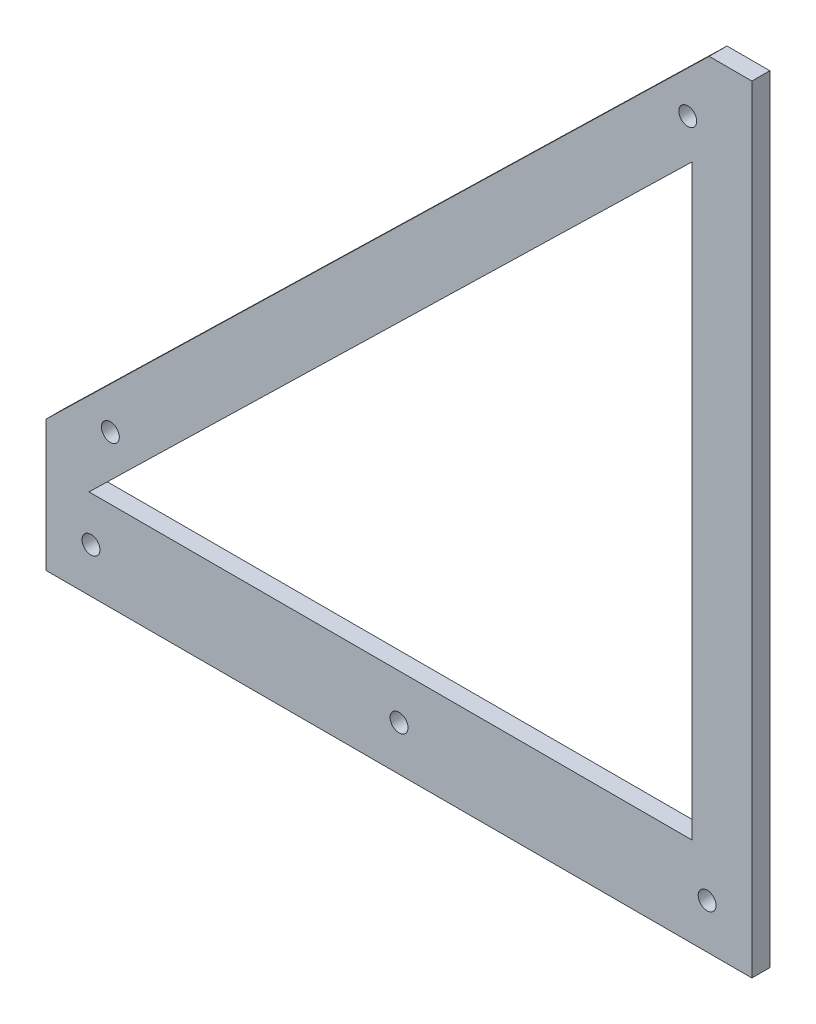
ISO-10303-21;
HEADER;
FILE_DESCRIPTION(('STEP AP214'),'2;1');
FILE_NAME('part.step','',(''),(''),'','','');
FILE_SCHEMA(('AUTOMOTIVE_DESIGN { 1 0 10303 214 1 1 1 1 }'));
ENDSEC;
DATA;
#1=APPLICATION_CONTEXT('core data for automotive mechanical design processes');
#2=APPLICATION_PROTOCOL_DEFINITION('international standard','automotive_design',2000,#1);
#3=PRODUCT_CONTEXT('',#1,'mechanical');
#4=PRODUCT('Part','Part','',(#3));
#5=PRODUCT_RELATED_PRODUCT_CATEGORY('part','',(#4));
#6=PRODUCT_DEFINITION_FORMATION('','',#4);
#7=PRODUCT_DEFINITION_CONTEXT('part definition',#1,'design');
#8=PRODUCT_DEFINITION('design','',#6,#7);
#9=PRODUCT_DEFINITION_SHAPE('','',#8);
#10=(LENGTH_UNIT() NAMED_UNIT(*) SI_UNIT(.MILLI.,.METRE.));
#11=(NAMED_UNIT(*) PLANE_ANGLE_UNIT() SI_UNIT($,.RADIAN.));
#12=(NAMED_UNIT(*) SI_UNIT($,.STERADIAN.) SOLID_ANGLE_UNIT());
#13=UNCERTAINTY_MEASURE_WITH_UNIT(LENGTH_MEASURE(1.E-05),#10,'distance_accuracy_value','');
#14=(GEOMETRIC_REPRESENTATION_CONTEXT(3) GLOBAL_UNCERTAINTY_ASSIGNED_CONTEXT((#13)) GLOBAL_UNIT_ASSIGNED_CONTEXT((#10,
#11,#12)) REPRESENTATION_CONTEXT('',''));
#15=CARTESIAN_POINT('',(0.,0.,0.));
#16=DIRECTION('',(0.,0.,1.));
#17=DIRECTION('',(1.,0.,0.));
#18=AXIS2_PLACEMENT_3D('',#15,#16,#17);
#19=CARTESIAN_POINT('',(0.,0.,3.));
#20=DIRECTION('',(0.,1.,0.));
#21=DIRECTION('',(0.,0.,1.));
#22=AXIS2_PLACEMENT_3D('',#19,#20,#21);
#23=PLANE('',#22);
#24=DIRECTION('',(1.,0.,0.));
#25=VECTOR('',#24,1.);
#26=CARTESIAN_POINT('',(0.,0.,0.));
#27=LINE('',#26,#25);
#28=CARTESIAN_POINT('',(7.16666666666672,0.,0.));
#29=VERTEX_POINT('',#28);
#30=CARTESIAN_POINT('',(108.208469633658,0.,0.));
#31=VERTEX_POINT('',#30);
#32=EDGE_CURVE('E124',#29,#31,#27,.T.);
#33=ORIENTED_EDGE('',*,*,#32,.F.);
#34=DIRECTION('',(0.,0.,-1.));
#35=VECTOR('',#34,1.);
#36=CARTESIAN_POINT('',(7.16666666666672,0.,3.));
#37=LINE('',#36,#35);
#38=CARTESIAN_POINT('',(7.16666666666672,0.,3.));
#39=VERTEX_POINT('',#38);
#40=EDGE_CURVE('E11',#39,#29,#37,.T.);
#41=ORIENTED_EDGE('',*,*,#40,.F.);
#42=DIRECTION('',(1.,0.,0.));
#43=VECTOR('',#42,1.);
#44=CARTESIAN_POINT('',(0.,0.,3.));
#45=LINE('',#44,#43);
#46=CARTESIAN_POINT('',(108.208469633658,0.,3.));
#47=VERTEX_POINT('',#46);
#48=EDGE_CURVE('E123',#39,#47,#45,.T.);
#49=ORIENTED_EDGE('',*,*,#48,.T.);
#50=DIRECTION('',(0.,0.,-1.));
#51=VECTOR('',#50,1.);
#52=CARTESIAN_POINT('',(108.208469633658,0.,3.));
#53=LINE('',#52,#51);
#54=EDGE_CURVE('E102',#47,#31,#53,.T.);
#55=ORIENTED_EDGE('',*,*,#54,.T.);
#56=EDGE_LOOP('',(#33,#41,#49,#55));
#57=FACE_BOUND('',#56,.T.);
#58=ADVANCED_FACE('F47',(#57),#23,.T.);
#59=CARTESIAN_POINT('',(3.48837209302328,-3.5820748373836,3.));
#60=DIRECTION('',(-0.697674418604651,0.716414967476715,0.));
#61=DIRECTION('',(-0.716414967476715,-0.697674418604651,0.));
#62=AXIS2_PLACEMENT_3D('',#59,#60,#61);
#63=PLANE('',#62);
#64=DIRECTION('',(0.716414967476715,0.697674418604651,0.));
#65=VECTOR('',#64,1.);
#66=CARTESIAN_POINT('',(3.48837209302328,-3.5820748373836,0.));
#67=LINE('',#66,#65);
#68=CARTESIAN_POINT('',(108.208469633658,98.3986716358666,0.));
#69=VERTEX_POINT('',#68);
#70=EDGE_CURVE('E187',#29,#69,#67,.T.);
#71=ORIENTED_EDGE('',*,*,#70,.T.);
#72=DIRECTION('',(0.,0.,-1.));
#73=VECTOR('',#72,1.);
#74=CARTESIAN_POINT('',(108.208469633658,98.3986716358666,3.));
#75=LINE('',#74,#73);
#76=CARTESIAN_POINT('',(108.208469633658,98.3986716358666,3.));
#77=VERTEX_POINT('',#76);
#78=EDGE_CURVE('E58',#77,#69,#75,.T.);
#79=ORIENTED_EDGE('',*,*,#78,.F.);
#80=DIRECTION('',(0.716414967476715,0.697674418604651,0.));
#81=VECTOR('',#80,1.);
#82=CARTESIAN_POINT('',(3.48837209302328,-3.5820748373836,3.));
#83=LINE('',#82,#81);
#84=EDGE_CURVE('E128',#39,#77,#83,.T.);
#85=ORIENTED_EDGE('',*,*,#84,.F.);
#86=ORIENTED_EDGE('',*,*,#40,.T.);
#87=EDGE_LOOP('',(#71,#79,#85,#86));
#88=FACE_BOUND('',#87,.T.);
#89=ADVANCED_FACE('F129',(#88),#63,.F.);
#90=CARTESIAN_POINT('',(118.208469633658,0.,3.));
#91=DIRECTION('',(1.,0.,0.));
#92=DIRECTION('',(0.,0.,-1.));
#93=AXIS2_PLACEMENT_3D('',#90,#91,#92);
#94=PLANE('',#93);
#95=DIRECTION('',(0.,-1.,0.));
#96=VECTOR('',#95,1.);
#97=CARTESIAN_POINT('',(118.208469633658,0.,0.));
#98=LINE('',#97,#96);
#99=CARTESIAN_POINT('',(118.208469633658,115.116279069767,0.));
#100=VERTEX_POINT('',#99);
#101=CARTESIAN_POINT('',(118.208469633658,-15.,0.));
#102=VERTEX_POINT('',#101);
#103=EDGE_CURVE('E165',#100,#102,#98,.T.);
#104=ORIENTED_EDGE('',*,*,#103,.F.);
#105=DIRECTION('',(0.,0.,-1.));
#106=VECTOR('',#105,1.);
#107=CARTESIAN_POINT('',(118.208469633658,115.116279069767,3.));
#108=LINE('',#107,#106);
#109=CARTESIAN_POINT('',(118.208469633658,115.116279069767,3.));
#110=VERTEX_POINT('',#109);
#111=EDGE_CURVE('E51',#110,#100,#108,.T.);
#112=ORIENTED_EDGE('',*,*,#111,.F.);
#113=DIRECTION('',(0.,-1.,0.));
#114=VECTOR('',#113,1.);
#115=CARTESIAN_POINT('',(118.208469633658,0.,3.));
#116=LINE('',#115,#114);
#117=CARTESIAN_POINT('',(118.208469633658,-15.,3.));
#118=VERTEX_POINT('',#117);
#119=EDGE_CURVE('E251',#110,#118,#116,.T.);
#120=ORIENTED_EDGE('',*,*,#119,.T.);
#121=DIRECTION('',(0.,0.,-1.));
#122=VECTOR('',#121,1.);
#123=CARTESIAN_POINT('',(118.208469633658,-15.,3.));
#124=LINE('',#123,#122);
#125=EDGE_CURVE('E160',#118,#102,#124,.T.);
#126=ORIENTED_EDGE('',*,*,#125,.T.);
#127=EDGE_LOOP('',(#104,#112,#120,#126));
#128=FACE_BOUND('',#127,.T.);
#129=ADVANCED_FACE('F233',(#128),#94,.T.);
#130=CARTESIAN_POINT('',(0.,115.116279069767,3.));
#131=DIRECTION('',(0.,1.,0.));
#132=DIRECTION('',(0.,0.,1.));
#133=AXIS2_PLACEMENT_3D('',#130,#131,#132);
#134=PLANE('',#133);
#135=DIRECTION('',(1.,0.,0.));
#136=VECTOR('',#135,1.);
#137=CARTESIAN_POINT('',(0.,115.116279069767,0.));
#138=LINE('',#137,#136);
#139=CARTESIAN_POINT('',(111.041802966991,115.116279069767,0.));
#140=VERTEX_POINT('',#139);
#141=EDGE_CURVE('E169',#140,#100,#138,.T.);
#142=ORIENTED_EDGE('',*,*,#141,.F.);
#143=DIRECTION('',(0.,0.,-1.));
#144=VECTOR('',#143,1.);
#145=CARTESIAN_POINT('',(111.041802966991,115.116279069767,3.));
#146=LINE('',#145,#144);
#147=CARTESIAN_POINT('',(111.041802966991,115.116279069767,3.));
#148=VERTEX_POINT('',#147);
#149=EDGE_CURVE('E221',#148,#140,#146,.T.);
#150=ORIENTED_EDGE('',*,*,#149,.F.);
#151=DIRECTION('',(1.,0.,0.));
#152=VECTOR('',#151,1.);
#153=CARTESIAN_POINT('',(0.,115.116279069767,3.));
#154=LINE('',#153,#152);
#155=EDGE_CURVE('E232',#148,#110,#154,.T.);
#156=ORIENTED_EDGE('',*,*,#155,.T.);
#157=ORIENTED_EDGE('',*,*,#111,.T.);
#158=EDGE_LOOP('',(#142,#150,#156,#157));
#159=FACE_BOUND('',#158,.T.);
#160=ADVANCED_FACE('F230',(#159),#134,.T.);
#161=CARTESIAN_POINT('',(-3.48837209302323,3.58207483738354,3.));
#162=DIRECTION('',(-0.697674418604651,0.716414967476714,0.));
#163=DIRECTION('',(-0.716414967476714,-0.697674418604651,0.));
#164=AXIS2_PLACEMENT_3D('',#161,#162,#163);
#165=PLANE('',#164);
#166=DIRECTION('',(0.716414967476715,0.697674418604651,0.));
#167=VECTOR('',#166,1.);
#168=CARTESIAN_POINT('',(-3.48837209302323,3.58207483738354,0.));
#169=LINE('',#168,#167);
#170=CARTESIAN_POINT('',(0.,6.97919533648279,0.));
#171=VERTEX_POINT('',#170);
#172=EDGE_CURVE('E173',#171,#140,#169,.T.);
#173=ORIENTED_EDGE('',*,*,#172,.F.);
#174=DIRECTION('',(0.,0.,-1.));
#175=VECTOR('',#174,1.);
#176=CARTESIAN_POINT('',(0.,6.97919533648279,3.));
#177=LINE('',#176,#175);
#178=CARTESIAN_POINT('',(0.,6.97919533648279,3.));
#179=VERTEX_POINT('',#178);
#180=EDGE_CURVE('E219',#179,#171,#177,.T.);
#181=ORIENTED_EDGE('',*,*,#180,.F.);
#182=DIRECTION('',(0.716414967476715,0.697674418604651,0.));
#183=VECTOR('',#182,1.);
#184=CARTESIAN_POINT('',(-3.48837209302323,3.58207483738354,3.));
#185=LINE('',#184,#183);
#186=EDGE_CURVE('E241',#179,#148,#185,.T.);
#187=ORIENTED_EDGE('',*,*,#186,.T.);
#188=ORIENTED_EDGE('',*,*,#149,.T.);
#189=EDGE_LOOP('',(#173,#181,#187,#188));
#190=FACE_BOUND('',#189,.T.);
#191=ADVANCED_FACE('F238',(#190),#165,.T.);
#192=CARTESIAN_POINT('',(0.,0.,3.));
#193=DIRECTION('',(1.,0.,0.));
#194=DIRECTION('',(0.,1.,0.));
#195=AXIS2_PLACEMENT_3D('',#192,#193,#194);
#196=PLANE('',#195);
#197=DIRECTION('',(0.,-1.,0.));
#198=VECTOR('',#197,1.);
#199=CARTESIAN_POINT('',(0.,0.,0.));
#200=LINE('',#199,#198);
#201=CARTESIAN_POINT('',(0.,-15.,0.));
#202=VERTEX_POINT('',#201);
#203=EDGE_CURVE('E177',#171,#202,#200,.T.);
#204=ORIENTED_EDGE('',*,*,#203,.T.);
#205=DIRECTION('',(0.,0.,-1.));
#206=VECTOR('',#205,1.);
#207=CARTESIAN_POINT('',(0.,-15.,3.));
#208=LINE('',#207,#206);
#209=CARTESIAN_POINT('',(0.,-15.,3.));
#210=VERTEX_POINT('',#209);
#211=EDGE_CURVE('E215',#210,#202,#208,.T.);
#212=ORIENTED_EDGE('',*,*,#211,.F.);
#213=DIRECTION('',(0.,-1.,0.));
#214=VECTOR('',#213,1.);
#215=CARTESIAN_POINT('',(0.,0.,3.));
#216=LINE('',#215,#214);
#217=EDGE_CURVE('E138',#179,#210,#216,.T.);
#218=ORIENTED_EDGE('',*,*,#217,.F.);
#219=ORIENTED_EDGE('',*,*,#180,.T.);
#220=EDGE_LOOP('',(#204,#212,#218,#219));
#221=FACE_BOUND('',#220,.T.);
#222=ADVANCED_FACE('F245',(#221),#196,.F.);
#223=CARTESIAN_POINT('',(59.104234816829,-7.5,3.));
#224=DIRECTION('',(0.,0.,-1.));
#225=DIRECTION('',(-1.,0.,0.));
#226=AXIS2_PLACEMENT_3D('',#223,#224,#225);
#227=CYLINDRICAL_SURFACE('',#226,1.5);
#228=CARTESIAN_POINT('',(59.104234816829,-7.5,3.));
#229=DIRECTION('',(0.,0.,1.));
#230=DIRECTION('',(1.,0.,0.));
#231=AXIS2_PLACEMENT_3D('',#228,#229,#230);
#232=CIRCLE('',#231,1.5);
#233=CARTESIAN_POINT('',(60.604234816829,-7.5,3.));
#234=VERTEX_POINT('',#233);
#235=EDGE_CURVE('E152',#234,#234,#232,.T.);
#236=ORIENTED_EDGE('',*,*,#235,.T.);
#237=EDGE_LOOP('',(#236));
#238=FACE_BOUND('',#237,.T.);
#239=CARTESIAN_POINT('',(59.104234816829,-7.5,0.));
#240=DIRECTION('',(0.,0.,1.));
#241=DIRECTION('',(1.,0.,0.));
#242=AXIS2_PLACEMENT_3D('',#239,#240,#241);
#243=CIRCLE('',#242,1.5);
#244=CARTESIAN_POINT('',(60.604234816829,-7.5,0.));
#245=VERTEX_POINT('',#244);
#246=EDGE_CURVE('E200',#245,#245,#243,.T.);
#247=ORIENTED_EDGE('',*,*,#246,.F.);
#248=EDGE_LOOP('',(#247));
#249=FACE_BOUND('',#248,.T.);
#250=ADVANCED_FACE('F288',(#238,#249),#227,.F.);
#251=CARTESIAN_POINT('',(110.708469633658,-7.5,3.));
#252=DIRECTION('',(0.,0.,-1.));
#253=DIRECTION('',(-1.,0.,0.));
#254=AXIS2_PLACEMENT_3D('',#251,#252,#253);
#255=CYLINDRICAL_SURFACE('',#254,1.5);
#256=CARTESIAN_POINT('',(110.708469633658,-7.5,3.));
#257=DIRECTION('',(0.,0.,1.));
#258=DIRECTION('',(1.,0.,0.));
#259=AXIS2_PLACEMENT_3D('',#256,#257,#258);
#260=CIRCLE('',#259,1.5);
#261=CARTESIAN_POINT('',(112.208469633658,-7.5,3.));
#262=VERTEX_POINT('',#261);
#263=EDGE_CURVE('E148',#262,#262,#260,.T.);
#264=ORIENTED_EDGE('',*,*,#263,.T.);
#265=EDGE_LOOP('',(#264));
#266=FACE_BOUND('',#265,.T.);
#267=CARTESIAN_POINT('',(110.708469633658,-7.5,0.));
#268=DIRECTION('',(0.,0.,1.));
#269=DIRECTION('',(1.,0.,0.));
#270=AXIS2_PLACEMENT_3D('',#267,#268,#269);
#271=CIRCLE('',#270,1.5);
#272=CARTESIAN_POINT('',(112.208469633658,-7.5,0.));
#273=VERTEX_POINT('',#272);
#274=EDGE_CURVE('E196',#273,#273,#271,.T.);
#275=ORIENTED_EDGE('',*,*,#274,.F.);
#276=EDGE_LOOP('',(#275));
#277=FACE_BOUND('',#276,.T.);
#278=ADVANCED_FACE('F315',(#266,#277),#255,.F.);
#279=CARTESIAN_POINT('',(107.462245121507,104.651162790698,3.));
#280=DIRECTION('',(0.,0.,-1.));
#281=DIRECTION('',(-1.,0.,0.));
#282=AXIS2_PLACEMENT_3D('',#279,#280,#281);
#283=CYLINDRICAL_SURFACE('',#282,1.5);
#284=CARTESIAN_POINT('',(107.462245121507,104.651162790698,3.));
#285=DIRECTION('',(0.,0.,1.));
#286=DIRECTION('',(1.,0.,0.));
#287=AXIS2_PLACEMENT_3D('',#284,#285,#286);
#288=CIRCLE('',#287,1.5);
#289=CARTESIAN_POINT('',(108.962245121507,104.651162790698,3.));
#290=VERTEX_POINT('',#289);
#291=EDGE_CURVE('E144',#290,#290,#288,.T.);
#292=ORIENTED_EDGE('',*,*,#291,.T.);
#293=EDGE_LOOP('',(#292));
#294=FACE_BOUND('',#293,.T.);
#295=CARTESIAN_POINT('',(107.462245121507,104.651162790698,0.));
#296=DIRECTION('',(0.,0.,1.));
#297=DIRECTION('',(1.,0.,0.));
#298=AXIS2_PLACEMENT_3D('',#295,#296,#297);
#299=CIRCLE('',#298,1.5);
#300=CARTESIAN_POINT('',(108.962245121507,104.651162790698,0.));
#301=VERTEX_POINT('',#300);
#302=EDGE_CURVE('E192',#301,#301,#299,.T.);
#303=ORIENTED_EDGE('',*,*,#302,.F.);
#304=EDGE_LOOP('',(#303));
#305=FACE_BOUND('',#304,.T.);
#306=ADVANCED_FACE('F323',(#294,#305),#283,.F.);
#307=CARTESIAN_POINT('',(108.208469633658,0.,3.));
#308=DIRECTION('',(1.,0.,0.));
#309=DIRECTION('',(0.,1.,0.));
#310=AXIS2_PLACEMENT_3D('',#307,#308,#309);
#311=PLANE('',#310);
#312=DIRECTION('',(0.,-1.,0.));
#313=VECTOR('',#312,1.);
#314=CARTESIAN_POINT('',(108.208469633658,0.,0.));
#315=LINE('',#314,#313);
#316=EDGE_CURVE('E95',#69,#31,#315,.T.);
#317=ORIENTED_EDGE('',*,*,#316,.T.);
#318=ORIENTED_EDGE('',*,*,#54,.F.);
#319=DIRECTION('',(0.,-1.,0.));
#320=VECTOR('',#319,1.);
#321=CARTESIAN_POINT('',(108.208469633658,0.,3.));
#322=LINE('',#321,#320);
#323=EDGE_CURVE('E67',#77,#47,#322,.T.);
#324=ORIENTED_EDGE('',*,*,#323,.F.);
#325=ORIENTED_EDGE('',*,*,#78,.T.);
#326=EDGE_LOOP('',(#317,#318,#324,#325));
#327=FACE_BOUND('',#326,.T.);
#328=ADVANCED_FACE('F284',(#327),#311,.F.);
#329=CARTESIAN_POINT('',(0.,-15.,3.));
#330=DIRECTION('',(0.,1.,0.));
#331=DIRECTION('',(0.,0.,1.));
#332=AXIS2_PLACEMENT_3D('',#329,#330,#331);
#333=PLANE('',#332);
#334=DIRECTION('',(1.,0.,0.));
#335=VECTOR('',#334,1.);
#336=CARTESIAN_POINT('',(0.,-15.,0.));
#337=LINE('',#336,#335);
#338=EDGE_CURVE('E181',#202,#102,#337,.T.);
#339=ORIENTED_EDGE('',*,*,#338,.T.);
#340=ORIENTED_EDGE('',*,*,#125,.F.);
#341=DIRECTION('',(1.,0.,0.));
#342=VECTOR('',#341,1.);
#343=CARTESIAN_POINT('',(0.,-15.,3.));
#344=LINE('',#343,#342);
#345=EDGE_CURVE('E135',#210,#118,#344,.T.);
#346=ORIENTED_EDGE('',*,*,#345,.F.);
#347=ORIENTED_EDGE('',*,*,#211,.T.);
#348=EDGE_LOOP('',(#339,#340,#346,#347));
#349=FACE_BOUND('',#348,.T.);
#350=ADVANCED_FACE('F281',(#349),#333,.F.);
#351=CARTESIAN_POINT('',(10.7462245121507,10.4651162790697,3.));
#352=DIRECTION('',(0.,0.,-1.));
#353=DIRECTION('',(-1.,0.,0.));
#354=AXIS2_PLACEMENT_3D('',#351,#352,#353);
#355=CYLINDRICAL_SURFACE('',#354,1.5);
#356=CARTESIAN_POINT('',(10.7462245121507,10.4651162790697,3.));
#357=DIRECTION('',(0.,0.,1.));
#358=DIRECTION('',(1.,0.,0.));
#359=AXIS2_PLACEMENT_3D('',#356,#357,#358);
#360=CIRCLE('',#359,1.5);
#361=CARTESIAN_POINT('',(12.2462245121507,10.4651162790697,3.));
#362=VERTEX_POINT('',#361);
#363=EDGE_CURVE('E208',#362,#362,#360,.T.);
#364=ORIENTED_EDGE('',*,*,#363,.T.);
#365=EDGE_LOOP('',(#364));
#366=FACE_BOUND('',#365,.T.);
#367=CARTESIAN_POINT('',(10.7462245121507,10.4651162790697,0.));
#368=DIRECTION('',(0.,0.,1.));
#369=DIRECTION('',(1.,0.,0.));
#370=AXIS2_PLACEMENT_3D('',#367,#368,#369);
#371=CIRCLE('',#370,1.5);
#372=CARTESIAN_POINT('',(12.2462245121507,10.4651162790697,0.));
#373=VERTEX_POINT('',#372);
#374=EDGE_CURVE('E161',#373,#373,#371,.T.);
#375=ORIENTED_EDGE('',*,*,#374,.F.);
#376=EDGE_LOOP('',(#375));
#377=FACE_BOUND('',#376,.T.);
#378=ADVANCED_FACE('F49',(#366,#377),#355,.F.);
#379=CARTESIAN_POINT('',(7.5,-7.5,3.));
#380=DIRECTION('',(0.,0.,-1.));
#381=DIRECTION('',(-1.,0.,0.));
#382=AXIS2_PLACEMENT_3D('',#379,#380,#381);
#383=CYLINDRICAL_SURFACE('',#382,1.5);
#384=CARTESIAN_POINT('',(7.5,-7.5,3.));
#385=DIRECTION('',(0.,0.,1.));
#386=DIRECTION('',(1.,0.,0.));
#387=AXIS2_PLACEMENT_3D('',#384,#385,#386);
#388=CIRCLE('',#387,1.5);
#389=CARTESIAN_POINT('',(9.,-7.5,3.));
#390=VERTEX_POINT('',#389);
#391=EDGE_CURVE('E156',#390,#390,#388,.T.);
#392=ORIENTED_EDGE('',*,*,#391,.T.);
#393=EDGE_LOOP('',(#392));
#394=FACE_BOUND('',#393,.T.);
#395=CARTESIAN_POINT('',(7.5,-7.5,0.));
#396=DIRECTION('',(0.,0.,1.));
#397=DIRECTION('',(1.,0.,0.));
#398=AXIS2_PLACEMENT_3D('',#395,#396,#397);
#399=CIRCLE('',#398,1.5);
#400=CARTESIAN_POINT('',(9.,-7.5,0.));
#401=VERTEX_POINT('',#400);
#402=EDGE_CURVE('E204',#401,#401,#399,.T.);
#403=ORIENTED_EDGE('',*,*,#402,.F.);
#404=EDGE_LOOP('',(#403));
#405=FACE_BOUND('',#404,.T.);
#406=ADVANCED_FACE('F263',(#394,#405),#383,.F.);
#407=CARTESIAN_POINT('',(0.,0.,3.));
#408=DIRECTION('',(0.,0.,1.));
#409=DIRECTION('',(1.,0.,0.));
#410=AXIS2_PLACEMENT_3D('',#407,#408,#409);
#411=PLANE('',#410);
#412=ORIENTED_EDGE('',*,*,#363,.F.);
#413=EDGE_LOOP('',(#412));
#414=FACE_BOUND('',#413,.T.);
#415=ORIENTED_EDGE('',*,*,#119,.F.);
#416=ORIENTED_EDGE('',*,*,#155,.F.);
#417=ORIENTED_EDGE('',*,*,#186,.F.);
#418=ORIENTED_EDGE('',*,*,#217,.T.);
#419=ORIENTED_EDGE('',*,*,#345,.T.);
#420=EDGE_LOOP('',(#415,#416,#417,#418,#419));
#421=FACE_BOUND('',#420,.T.);
#422=ORIENTED_EDGE('',*,*,#48,.F.);
#423=ORIENTED_EDGE('',*,*,#84,.T.);
#424=ORIENTED_EDGE('',*,*,#323,.T.);
#425=EDGE_LOOP('',(#422,#423,#424));
#426=FACE_BOUND('',#425,.T.);
#427=ORIENTED_EDGE('',*,*,#291,.F.);
#428=EDGE_LOOP('',(#427));
#429=FACE_BOUND('',#428,.T.);
#430=ORIENTED_EDGE('',*,*,#263,.F.);
#431=EDGE_LOOP('',(#430));
#432=FACE_BOUND('',#431,.T.);
#433=ORIENTED_EDGE('',*,*,#235,.F.);
#434=EDGE_LOOP('',(#433));
#435=FACE_BOUND('',#434,.T.);
#436=ORIENTED_EDGE('',*,*,#391,.F.);
#437=EDGE_LOOP('',(#436));
#438=FACE_BOUND('',#437,.T.);
#439=ADVANCED_FACE('F132',(#414,#421,#426,#429,#432,#435,#438),#411,.T.);
#440=CARTESIAN_POINT('',(0.,0.,0.));
#441=DIRECTION('',(0.,0.,1.));
#442=DIRECTION('',(1.,0.,0.));
#443=AXIS2_PLACEMENT_3D('',#440,#441,#442);
#444=PLANE('',#443);
#445=ORIENTED_EDGE('',*,*,#374,.T.);
#446=EDGE_LOOP('',(#445));
#447=FACE_BOUND('',#446,.T.);
#448=ORIENTED_EDGE('',*,*,#103,.T.);
#449=ORIENTED_EDGE('',*,*,#338,.F.);
#450=ORIENTED_EDGE('',*,*,#203,.F.);
#451=ORIENTED_EDGE('',*,*,#172,.T.);
#452=ORIENTED_EDGE('',*,*,#141,.T.);
#453=EDGE_LOOP('',(#448,#449,#450,#451,#452));
#454=FACE_BOUND('',#453,.T.);
#455=ORIENTED_EDGE('',*,*,#32,.T.);
#456=ORIENTED_EDGE('',*,*,#316,.F.);
#457=ORIENTED_EDGE('',*,*,#70,.F.);
#458=EDGE_LOOP('',(#455,#456,#457));
#459=FACE_BOUND('',#458,.T.);
#460=ORIENTED_EDGE('',*,*,#302,.T.);
#461=EDGE_LOOP('',(#460));
#462=FACE_BOUND('',#461,.T.);
#463=ORIENTED_EDGE('',*,*,#274,.T.);
#464=EDGE_LOOP('',(#463));
#465=FACE_BOUND('',#464,.T.);
#466=ORIENTED_EDGE('',*,*,#246,.T.);
#467=EDGE_LOOP('',(#466));
#468=FACE_BOUND('',#467,.T.);
#469=ORIENTED_EDGE('',*,*,#402,.T.);
#470=EDGE_LOOP('',(#469));
#471=FACE_BOUND('',#470,.T.);
#472=ADVANCED_FACE('F236',(#447,#454,#459,#462,#465,#468,#471),#444,.F.);
#473=CLOSED_SHELL('',(#58,#89,#129,#160,#191,#222,#250,#278,#306,#328,#350,#378,#406,#439,#472));
#474=MANIFOLD_SOLID_BREP('B2',#473);
#475=ADVANCED_BREP_SHAPE_REPRESENTATION('',(#18,#474),#14);
#476=SHAPE_DEFINITION_REPRESENTATION(#9,#475);
ENDSEC;
END-ISO-10303-21;
